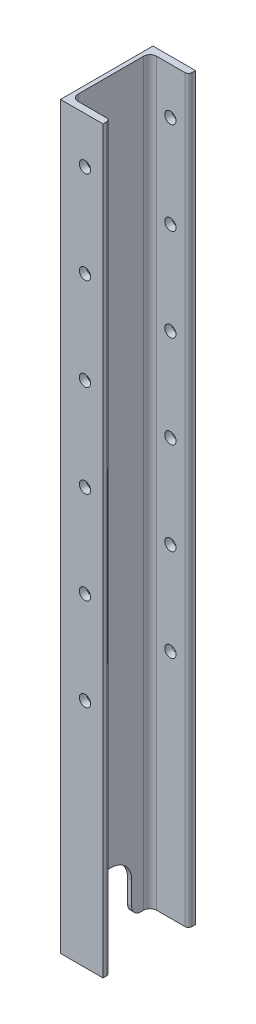
ISO-10303-21;
HEADER;
FILE_DESCRIPTION(('STEP AP214'),'2;1');
FILE_NAME('part.step','',(''),(''),'','','');
FILE_SCHEMA(('AUTOMOTIVE_DESIGN { 1 0 10303 214 1 1 1 1 }'));
ENDSEC;
DATA;
#1=APPLICATION_CONTEXT('core data for automotive mechanical design processes');
#2=APPLICATION_PROTOCOL_DEFINITION('international standard','automotive_design',2000,#1);
#3=PRODUCT_CONTEXT('',#1,'mechanical');
#4=PRODUCT('Part','Part','',(#3));
#5=PRODUCT_RELATED_PRODUCT_CATEGORY('part','',(#4));
#6=PRODUCT_DEFINITION_FORMATION('','',#4);
#7=PRODUCT_DEFINITION_CONTEXT('part definition',#1,'design');
#8=PRODUCT_DEFINITION('design','',#6,#7);
#9=PRODUCT_DEFINITION_SHAPE('','',#8);
#10=(LENGTH_UNIT() NAMED_UNIT(*) SI_UNIT(.MILLI.,.METRE.));
#11=(NAMED_UNIT(*) PLANE_ANGLE_UNIT() SI_UNIT($,.RADIAN.));
#12=(NAMED_UNIT(*) SI_UNIT($,.STERADIAN.) SOLID_ANGLE_UNIT());
#13=UNCERTAINTY_MEASURE_WITH_UNIT(LENGTH_MEASURE(1.E-05),#10,'distance_accuracy_value','');
#14=(GEOMETRIC_REPRESENTATION_CONTEXT(3) GLOBAL_UNCERTAINTY_ASSIGNED_CONTEXT((#13)) GLOBAL_UNIT_ASSIGNED_CONTEXT((#10,
#11,#12)) REPRESENTATION_CONTEXT('',''));
#15=CARTESIAN_POINT('',(0.,0.,0.));
#16=DIRECTION('',(0.,0.,1.));
#17=DIRECTION('',(1.,0.,0.));
#18=AXIS2_PLACEMENT_3D('',#15,#16,#17);
#19=CARTESIAN_POINT('',(11.5,0.,35.4));
#20=DIRECTION('',(0.,1.,0.));
#21=DIRECTION('',(0.,0.,1.));
#22=AXIS2_PLACEMENT_3D('',#19,#20,#21);
#23=PLANE('',#22);
#24=DIRECTION('',(0.,0.,1.));
#25=VECTOR('',#24,1.);
#26=CARTESIAN_POINT('',(0.,0.,50.));
#27=LINE('',#26,#25);
#28=CARTESIAN_POINT('',(0.,0.,32.5));
#29=VERTEX_POINT('',#28);
#30=CARTESIAN_POINT('',(0.,0.,50.));
#31=VERTEX_POINT('',#30);
#32=EDGE_CURVE('E239',#29,#31,#27,.T.);
#33=ORIENTED_EDGE('',*,*,#32,.F.);
#34=DIRECTION('',(1.,0.,0.));
#35=VECTOR('',#34,1.);
#36=CARTESIAN_POINT('',(11.5,0.,32.5));
#37=LINE('',#36,#35);
#38=CARTESIAN_POINT('',(4.50000000000001,0.,32.5));
#39=VERTEX_POINT('',#38);
#40=EDGE_CURVE('E49',#29,#39,#37,.T.);
#41=ORIENTED_EDGE('',*,*,#40,.T.);
#42=DIRECTION('',(0.,0.,-1.));
#43=VECTOR('',#42,1.);
#44=CARTESIAN_POINT('',(4.5,0.,-35.3999999999999));
#45=LINE('',#44,#43);
#46=CARTESIAN_POINT('',(4.50000000000001,0.,35.3999999999999));
#47=VERTEX_POINT('',#46);
#48=EDGE_CURVE('E227',#47,#39,#45,.T.);
#49=ORIENTED_EDGE('',*,*,#48,.F.);
#50=CARTESIAN_POINT('',(11.5,0.,35.4));
#51=DIRECTION('',(0.,-1.,0.));
#52=DIRECTION('',(0.,0.,1.));
#53=AXIS2_PLACEMENT_3D('',#50,#51,#52);
#54=CIRCLE('',#53,7.);
#55=CARTESIAN_POINT('',(11.5000000000001,0.,42.4));
#56=VERTEX_POINT('',#55);
#57=EDGE_CURVE('E192',#56,#47,#54,.T.);
#58=ORIENTED_EDGE('',*,*,#57,.F.);
#59=DIRECTION('',(-1.,0.,0.));
#60=VECTOR('',#59,1.);
#61=CARTESIAN_POINT('',(11.5000000000001,0.,42.4));
#62=LINE('',#61,#60);
#63=CARTESIAN_POINT('',(42.,0.,42.4));
#64=VERTEX_POINT('',#63);
#65=EDGE_CURVE('E204',#64,#56,#62,.T.);
#66=ORIENTED_EDGE('',*,*,#65,.F.);
#67=CARTESIAN_POINT('',(42.,0.,46.4));
#68=DIRECTION('',(0.,1.,0.));
#69=DIRECTION('',(0.,0.,-1.));
#70=AXIS2_PLACEMENT_3D('',#67,#68,#69);
#71=CIRCLE('',#70,4.);
#72=CARTESIAN_POINT('',(46.,0.,46.4));
#73=VERTEX_POINT('',#72);
#74=EDGE_CURVE('E247',#73,#64,#71,.T.);
#75=ORIENTED_EDGE('',*,*,#74,.F.);
#76=DIRECTION('',(0.,0.,-1.));
#77=VECTOR('',#76,1.);
#78=CARTESIAN_POINT('',(46.,0.,46.4));
#79=LINE('',#78,#77);
#80=CARTESIAN_POINT('',(46.,0.,50.));
#81=VERTEX_POINT('',#80);
#82=EDGE_CURVE('E245',#81,#73,#79,.T.);
#83=ORIENTED_EDGE('',*,*,#82,.F.);
#84=DIRECTION('',(1.,0.,0.));
#85=VECTOR('',#84,1.);
#86=CARTESIAN_POINT('',(46.,0.,50.));
#87=LINE('',#86,#85);
#88=EDGE_CURVE('E243',#31,#81,#87,.T.);
#89=ORIENTED_EDGE('',*,*,#88,.F.);
#90=EDGE_LOOP('',(#33,#41,#49,#58,#66,#75,#83,#89));
#91=FACE_BOUND('',#90,.T.);
#92=ADVANCED_FACE('F40',(#91),#23,.F.);
#93=CARTESIAN_POINT('',(11.5,800.,35.4));
#94=DIRECTION('',(0.,-1.,0.));
#95=DIRECTION('',(0.,0.,-1.));
#96=AXIS2_PLACEMENT_3D('',#93,#94,#95);
#97=CYLINDRICAL_SURFACE('',#96,7.);
#98=ORIENTED_EDGE('',*,*,#57,.T.);
#99=DIRECTION('',(0.,-1.,0.));
#100=VECTOR('',#99,1.);
#101=CARTESIAN_POINT('',(4.50000000000001,800.,35.3999999999999));
#102=LINE('',#101,#100);
#103=CARTESIAN_POINT('',(4.50000000000001,800.,35.3999999999999));
#104=VERTEX_POINT('',#103);
#105=EDGE_CURVE('E282',#104,#47,#102,.T.);
#106=ORIENTED_EDGE('',*,*,#105,.F.);
#107=CARTESIAN_POINT('',(11.5,800.,35.4));
#108=DIRECTION('',(0.,-1.,0.));
#109=DIRECTION('',(0.,0.,1.));
#110=AXIS2_PLACEMENT_3D('',#107,#108,#109);
#111=CIRCLE('',#110,7.);
#112=CARTESIAN_POINT('',(11.5000000000001,800.,42.4));
#113=VERTEX_POINT('',#112);
#114=EDGE_CURVE('E200',#113,#104,#111,.T.);
#115=ORIENTED_EDGE('',*,*,#114,.F.);
#116=DIRECTION('',(0.,-1.,0.));
#117=VECTOR('',#116,1.);
#118=CARTESIAN_POINT('',(11.5000000000001,800.,42.4));
#119=LINE('',#118,#117);
#120=EDGE_CURVE('E225',#113,#56,#119,.T.);
#121=ORIENTED_EDGE('',*,*,#120,.T.);
#122=EDGE_LOOP('',(#98,#106,#115,#121));
#123=FACE_BOUND('',#122,.T.);
#124=ADVANCED_FACE('F355',(#123),#97,.F.);
#125=CARTESIAN_POINT('',(4.5,800.,-35.3999999999999));
#126=DIRECTION('',(-1.,0.,0.));
#127=DIRECTION('',(0.,0.,1.));
#128=AXIS2_PLACEMENT_3D('',#125,#126,#127);
#129=PLANE('',#128);
#130=DIRECTION('',(0.,-1.,0.));
#131=VECTOR('',#130,1.);
#132=CARTESIAN_POINT('',(4.5,800.,-22.5000000000001));
#133=LINE('',#132,#131);
#134=CARTESIAN_POINT('',(4.5,35.,-22.5));
#135=VERTEX_POINT('',#134);
#136=CARTESIAN_POINT('',(4.5,10.,-22.5));
#137=VERTEX_POINT('',#136);
#138=EDGE_CURVE('E166',#135,#137,#133,.T.);
#139=ORIENTED_EDGE('',*,*,#138,.T.);
#140=CARTESIAN_POINT('',(4.5,10.,-32.5));
#141=DIRECTION('',(-1.,0.,0.));
#142=DIRECTION('',(0.,0.,1.));
#143=AXIS2_PLACEMENT_3D('',#140,#141,#142);
#144=CIRCLE('',#143,10.);
#145=CARTESIAN_POINT('',(4.5,0.,-32.5));
#146=VERTEX_POINT('',#145);
#147=EDGE_CURVE('E295',#137,#146,#144,.F.);
#148=ORIENTED_EDGE('',*,*,#147,.T.);
#149=CARTESIAN_POINT('',(4.5,0.,-35.3999999999999));
#150=VERTEX_POINT('',#149);
#151=EDGE_CURVE('E195',#146,#150,#45,.T.);
#152=ORIENTED_EDGE('',*,*,#151,.T.);
#153=DIRECTION('',(0.,-1.,0.));
#154=VECTOR('',#153,1.);
#155=CARTESIAN_POINT('',(4.5,800.,-35.3999999999999));
#156=LINE('',#155,#154);
#157=CARTESIAN_POINT('',(4.5,800.,-35.3999999999999));
#158=VERTEX_POINT('',#157);
#159=EDGE_CURVE('E279',#158,#150,#156,.T.);
#160=ORIENTED_EDGE('',*,*,#159,.F.);
#161=DIRECTION('',(0.,0.,-1.));
#162=VECTOR('',#161,1.);
#163=CARTESIAN_POINT('',(4.5,800.,-35.3999999999999));
#164=LINE('',#163,#162);
#165=EDGE_CURVE('E203',#104,#158,#164,.T.);
#166=ORIENTED_EDGE('',*,*,#165,.F.);
#167=ORIENTED_EDGE('',*,*,#105,.T.);
#168=ORIENTED_EDGE('',*,*,#48,.T.);
#169=CARTESIAN_POINT('',(4.50000000000001,10.,32.5));
#170=DIRECTION('',(-1.,0.,0.));
#171=DIRECTION('',(0.,0.,1.));
#172=AXIS2_PLACEMENT_3D('',#169,#170,#171);
#173=CIRCLE('',#172,10.);
#174=CARTESIAN_POINT('',(4.50000000000001,10.,22.5));
#175=VERTEX_POINT('',#174);
#176=EDGE_CURVE('E57',#39,#175,#173,.F.);
#177=ORIENTED_EDGE('',*,*,#176,.T.);
#178=DIRECTION('',(0.,1.,0.));
#179=VECTOR('',#178,1.);
#180=CARTESIAN_POINT('',(4.50000000000001,800.,22.5000000000001));
#181=LINE('',#180,#179);
#182=CARTESIAN_POINT('',(4.50000000000001,35.,22.5));
#183=VERTEX_POINT('',#182);
#184=EDGE_CURVE('E191',#175,#183,#181,.T.);
#185=ORIENTED_EDGE('',*,*,#184,.T.);
#186=CARTESIAN_POINT('',(4.5,35.,0.));
#187=DIRECTION('',(-1.,0.,0.));
#188=DIRECTION('',(0.,0.,1.));
#189=AXIS2_PLACEMENT_3D('',#186,#187,#188);
#190=CIRCLE('',#189,22.5);
#191=EDGE_CURVE('E183',#183,#135,#190,.T.);
#192=ORIENTED_EDGE('',*,*,#191,.T.);
#193=EDGE_LOOP('',(#139,#148,#152,#160,#166,#167,#168,#177,#185,#192));
#194=FACE_BOUND('',#193,.T.);
#195=ADVANCED_FACE('F190',(#194),#129,.F.);
#196=CARTESIAN_POINT('',(11.5,800.,-35.4));
#197=DIRECTION('',(0.,-1.,0.));
#198=DIRECTION('',(0.,0.,-1.));
#199=AXIS2_PLACEMENT_3D('',#196,#197,#198);
#200=CYLINDRICAL_SURFACE('',#199,7.);
#201=CARTESIAN_POINT('',(11.5,0.,-35.4));
#202=DIRECTION('',(0.,-1.,0.));
#203=DIRECTION('',(0.,0.,1.));
#204=AXIS2_PLACEMENT_3D('',#201,#202,#203);
#205=CIRCLE('',#204,7.);
#206=CARTESIAN_POINT('',(11.5,0.,-42.4));
#207=VERTEX_POINT('',#206);
#208=EDGE_CURVE('E229',#150,#207,#205,.T.);
#209=ORIENTED_EDGE('',*,*,#208,.T.);
#210=DIRECTION('',(0.,-1.,0.));
#211=VECTOR('',#210,1.);
#212=CARTESIAN_POINT('',(11.5,800.,-42.4));
#213=LINE('',#212,#211);
#214=CARTESIAN_POINT('',(11.5,800.,-42.4));
#215=VERTEX_POINT('',#214);
#216=EDGE_CURVE('E276',#215,#207,#213,.T.);
#217=ORIENTED_EDGE('',*,*,#216,.F.);
#218=CARTESIAN_POINT('',(11.5,800.,-35.4));
#219=DIRECTION('',(0.,-1.,0.));
#220=DIRECTION('',(0.,0.,1.));
#221=AXIS2_PLACEMENT_3D('',#218,#219,#220);
#222=CIRCLE('',#221,7.);
#223=EDGE_CURVE('E206',#158,#215,#222,.T.);
#224=ORIENTED_EDGE('',*,*,#223,.F.);
#225=ORIENTED_EDGE('',*,*,#159,.T.);
#226=EDGE_LOOP('',(#209,#217,#224,#225));
#227=FACE_BOUND('',#226,.T.);
#228=ADVANCED_FACE('F399',(#227),#200,.F.);
#229=CARTESIAN_POINT('',(42.,800.,-42.4));
#230=DIRECTION('',(0.,0.,-1.));
#231=DIRECTION('',(-1.,0.,0.));
#232=AXIS2_PLACEMENT_3D('',#229,#230,#231);
#233=PLANE('',#232);
#234=CARTESIAN_POINT('',(26.44,750.,-42.4));
#235=DIRECTION('',(0.,0.,-1.));
#236=DIRECTION('',(-1.,0.,0.));
#237=AXIS2_PLACEMENT_3D('',#234,#235,#236);
#238=CIRCLE('',#237,6.10000000000005);
#239=CARTESIAN_POINT('',(20.34,750.,-42.4));
#240=VERTEX_POINT('',#239);
#241=EDGE_CURVE('E188',#240,#240,#238,.T.);
#242=ORIENTED_EDGE('',*,*,#241,.T.);
#243=EDGE_LOOP('',(#242));
#244=FACE_BOUND('',#243,.T.);
#245=CARTESIAN_POINT('',(26.439999999999,650.,-42.4));
#246=DIRECTION('',(0.,0.,-1.));
#247=DIRECTION('',(-1.,0.,0.));
#248=AXIS2_PLACEMENT_3D('',#245,#246,#247);
#249=CIRCLE('',#248,6.10000000000005);
#250=CARTESIAN_POINT('',(20.3399999999989,650.,-42.4));
#251=VERTEX_POINT('',#250);
#252=EDGE_CURVE('E324',#251,#251,#249,.T.);
#253=ORIENTED_EDGE('',*,*,#252,.T.);
#254=EDGE_LOOP('',(#253));
#255=FACE_BOUND('',#254,.T.);
#256=CARTESIAN_POINT('',(26.4399999999979,550.,-42.4));
#257=DIRECTION('',(0.,0.,-1.));
#258=DIRECTION('',(-1.,0.,0.));
#259=AXIS2_PLACEMENT_3D('',#256,#257,#258);
#260=CIRCLE('',#259,6.10000000000003);
#261=CARTESIAN_POINT('',(20.3399999999979,550.,-42.4));
#262=VERTEX_POINT('',#261);
#263=EDGE_CURVE('E320',#262,#262,#260,.T.);
#264=ORIENTED_EDGE('',*,*,#263,.T.);
#265=EDGE_LOOP('',(#264));
#266=FACE_BOUND('',#265,.T.);
#267=CARTESIAN_POINT('',(26.4399999999969,450.,-42.4));
#268=DIRECTION('',(0.,0.,-1.));
#269=DIRECTION('',(-1.,0.,0.));
#270=AXIS2_PLACEMENT_3D('',#267,#268,#269);
#271=CIRCLE('',#270,6.10000000000001);
#272=CARTESIAN_POINT('',(20.3399999999969,450.,-42.4));
#273=VERTEX_POINT('',#272);
#274=EDGE_CURVE('E316',#273,#273,#271,.T.);
#275=ORIENTED_EDGE('',*,*,#274,.T.);
#276=EDGE_LOOP('',(#275));
#277=FACE_BOUND('',#276,.T.);
#278=CARTESIAN_POINT('',(26.4399999999958,350.,-42.4));
#279=DIRECTION('',(0.,0.,-1.));
#280=DIRECTION('',(-1.,0.,0.));
#281=AXIS2_PLACEMENT_3D('',#278,#279,#280);
#282=CIRCLE('',#281,6.10000000000001);
#283=CARTESIAN_POINT('',(20.3399999999958,350.,-42.4));
#284=VERTEX_POINT('',#283);
#285=EDGE_CURVE('E312',#284,#284,#282,.T.);
#286=ORIENTED_EDGE('',*,*,#285,.T.);
#287=EDGE_LOOP('',(#286));
#288=FACE_BOUND('',#287,.T.);
#289=CARTESIAN_POINT('',(26.4399999999948,250.,-42.4));
#290=DIRECTION('',(0.,0.,-1.));
#291=DIRECTION('',(-1.,0.,0.));
#292=AXIS2_PLACEMENT_3D('',#289,#290,#291);
#293=CIRCLE('',#292,6.10000000000001);
#294=CARTESIAN_POINT('',(20.3399999999948,250.,-42.4));
#295=VERTEX_POINT('',#294);
#296=EDGE_CURVE('E307',#295,#295,#293,.T.);
#297=ORIENTED_EDGE('',*,*,#296,.T.);
#298=EDGE_LOOP('',(#297));
#299=FACE_BOUND('',#298,.T.);
#300=DIRECTION('',(1.,0.,0.));
#301=VECTOR('',#300,1.);
#302=CARTESIAN_POINT('',(42.,0.,-42.4));
#303=LINE('',#302,#301);
#304=CARTESIAN_POINT('',(42.,0.,-42.4));
#305=VERTEX_POINT('',#304);
#306=EDGE_CURVE('E231',#207,#305,#303,.T.);
#307=ORIENTED_EDGE('',*,*,#306,.T.);
#308=DIRECTION('',(0.,-1.,0.));
#309=VECTOR('',#308,1.);
#310=CARTESIAN_POINT('',(42.,800.,-42.4));
#311=LINE('',#310,#309);
#312=CARTESIAN_POINT('',(42.,800.,-42.4));
#313=VERTEX_POINT('',#312);
#314=EDGE_CURVE('E273',#313,#305,#311,.T.);
#315=ORIENTED_EDGE('',*,*,#314,.F.);
#316=DIRECTION('',(1.,0.,0.));
#317=VECTOR('',#316,1.);
#318=CARTESIAN_POINT('',(42.,800.,-42.4));
#319=LINE('',#318,#317);
#320=EDGE_CURVE('E208',#215,#313,#319,.T.);
#321=ORIENTED_EDGE('',*,*,#320,.F.);
#322=ORIENTED_EDGE('',*,*,#216,.T.);
#323=EDGE_LOOP('',(#307,#315,#321,#322));
#324=FACE_BOUND('',#323,.T.);
#325=ADVANCED_FACE('F403',(#244,#255,#266,#277,#288,#299,#324),#233,.F.);
#326=CARTESIAN_POINT('',(42.,800.,-46.4));
#327=DIRECTION('',(0.,-1.,0.));
#328=DIRECTION('',(0.,0.,-1.));
#329=AXIS2_PLACEMENT_3D('',#326,#327,#328);
#330=CYLINDRICAL_SURFACE('',#329,4.);
#331=CARTESIAN_POINT('',(42.,0.,-46.4));
#332=DIRECTION('',(0.,1.,0.));
#333=DIRECTION('',(0.,0.,-1.));
#334=AXIS2_PLACEMENT_3D('',#331,#332,#333);
#335=CIRCLE('',#334,4.);
#336=CARTESIAN_POINT('',(46.,0.,-46.4));
#337=VERTEX_POINT('',#336);
#338=EDGE_CURVE('E233',#305,#337,#335,.T.);
#339=ORIENTED_EDGE('',*,*,#338,.T.);
#340=DIRECTION('',(0.,-1.,0.));
#341=VECTOR('',#340,1.);
#342=CARTESIAN_POINT('',(46.,800.,-46.4));
#343=LINE('',#342,#341);
#344=CARTESIAN_POINT('',(46.,800.,-46.4));
#345=VERTEX_POINT('',#344);
#346=EDGE_CURVE('E270',#345,#337,#343,.T.);
#347=ORIENTED_EDGE('',*,*,#346,.F.);
#348=CARTESIAN_POINT('',(42.,800.,-46.4));
#349=DIRECTION('',(0.,1.,0.));
#350=DIRECTION('',(0.,0.,-1.));
#351=AXIS2_PLACEMENT_3D('',#348,#349,#350);
#352=CIRCLE('',#351,4.);
#353=EDGE_CURVE('E210',#313,#345,#352,.T.);
#354=ORIENTED_EDGE('',*,*,#353,.F.);
#355=ORIENTED_EDGE('',*,*,#314,.T.);
#356=EDGE_LOOP('',(#339,#347,#354,#355));
#357=FACE_BOUND('',#356,.T.);
#358=ADVANCED_FACE('F408',(#357),#330,.T.);
#359=CARTESIAN_POINT('',(46.,800.,-50.));
#360=DIRECTION('',(-1.,0.,0.));
#361=DIRECTION('',(0.,0.,1.));
#362=AXIS2_PLACEMENT_3D('',#359,#360,#361);
#363=PLANE('',#362);
#364=DIRECTION('',(0.,0.,-1.));
#365=VECTOR('',#364,1.);
#366=CARTESIAN_POINT('',(46.,0.,-50.));
#367=LINE('',#366,#365);
#368=CARTESIAN_POINT('',(46.,0.,-50.));
#369=VERTEX_POINT('',#368);
#370=EDGE_CURVE('E235',#337,#369,#367,.T.);
#371=ORIENTED_EDGE('',*,*,#370,.T.);
#372=DIRECTION('',(0.,-1.,0.));
#373=VECTOR('',#372,1.);
#374=CARTESIAN_POINT('',(46.,800.,-50.));
#375=LINE('',#374,#373);
#376=CARTESIAN_POINT('',(46.,800.,-50.));
#377=VERTEX_POINT('',#376);
#378=EDGE_CURVE('E267',#377,#369,#375,.T.);
#379=ORIENTED_EDGE('',*,*,#378,.F.);
#380=DIRECTION('',(0.,0.,-1.));
#381=VECTOR('',#380,1.);
#382=CARTESIAN_POINT('',(46.,800.,-50.));
#383=LINE('',#382,#381);
#384=EDGE_CURVE('E212',#345,#377,#383,.T.);
#385=ORIENTED_EDGE('',*,*,#384,.F.);
#386=ORIENTED_EDGE('',*,*,#346,.T.);
#387=EDGE_LOOP('',(#371,#379,#385,#386));
#388=FACE_BOUND('',#387,.T.);
#389=ADVANCED_FACE('F410',(#388),#363,.F.);
#390=CARTESIAN_POINT('',(0.,800.,-50.));
#391=DIRECTION('',(0.,0.,1.));
#392=DIRECTION('',(1.,0.,0.));
#393=AXIS2_PLACEMENT_3D('',#390,#391,#392);
#394=PLANE('',#393);
#395=CARTESIAN_POINT('',(26.44,750.,-50.));
#396=DIRECTION('',(0.,0.,1.));
#397=DIRECTION('',(1.,0.,0.));
#398=AXIS2_PLACEMENT_3D('',#395,#396,#397);
#399=CIRCLE('',#398,6.10000000000005);
#400=CARTESIAN_POINT('',(32.5400000000001,750.,-50.));
#401=VERTEX_POINT('',#400);
#402=EDGE_CURVE('E336',#401,#401,#399,.T.);
#403=ORIENTED_EDGE('',*,*,#402,.T.);
#404=EDGE_LOOP('',(#403));
#405=FACE_BOUND('',#404,.T.);
#406=CARTESIAN_POINT('',(26.439999999999,650.,-50.));
#407=DIRECTION('',(0.,0.,1.));
#408=DIRECTION('',(1.,0.,0.));
#409=AXIS2_PLACEMENT_3D('',#406,#407,#408);
#410=CIRCLE('',#409,6.10000000000005);
#411=CARTESIAN_POINT('',(32.539999999999,650.,-50.));
#412=VERTEX_POINT('',#411);
#413=EDGE_CURVE('E319',#412,#412,#410,.T.);
#414=ORIENTED_EDGE('',*,*,#413,.T.);
#415=EDGE_LOOP('',(#414));
#416=FACE_BOUND('',#415,.T.);
#417=CARTESIAN_POINT('',(26.4399999999979,550.,-50.));
#418=DIRECTION('',(0.,0.,1.));
#419=DIRECTION('',(1.,0.,0.));
#420=AXIS2_PLACEMENT_3D('',#417,#418,#419);
#421=CIRCLE('',#420,6.10000000000003);
#422=CARTESIAN_POINT('',(32.5399999999979,550.,-50.));
#423=VERTEX_POINT('',#422);
#424=EDGE_CURVE('E315',#423,#423,#421,.T.);
#425=ORIENTED_EDGE('',*,*,#424,.T.);
#426=EDGE_LOOP('',(#425));
#427=FACE_BOUND('',#426,.T.);
#428=CARTESIAN_POINT('',(26.4399999999969,450.,-50.));
#429=DIRECTION('',(0.,0.,1.));
#430=DIRECTION('',(1.,0.,0.));
#431=AXIS2_PLACEMENT_3D('',#428,#429,#430);
#432=CIRCLE('',#431,6.10000000000001);
#433=CARTESIAN_POINT('',(32.5399999999969,450.,-50.));
#434=VERTEX_POINT('',#433);
#435=EDGE_CURVE('E311',#434,#434,#432,.T.);
#436=ORIENTED_EDGE('',*,*,#435,.T.);
#437=EDGE_LOOP('',(#436));
#438=FACE_BOUND('',#437,.T.);
#439=CARTESIAN_POINT('',(26.4399999999958,350.,-50.));
#440=DIRECTION('',(0.,0.,1.));
#441=DIRECTION('',(1.,0.,0.));
#442=AXIS2_PLACEMENT_3D('',#439,#440,#441);
#443=CIRCLE('',#442,6.10000000000001);
#444=CARTESIAN_POINT('',(32.5399999999958,350.,-50.));
#445=VERTEX_POINT('',#444);
#446=EDGE_CURVE('E306',#445,#445,#443,.T.);
#447=ORIENTED_EDGE('',*,*,#446,.T.);
#448=EDGE_LOOP('',(#447));
#449=FACE_BOUND('',#448,.T.);
#450=CARTESIAN_POINT('',(26.4399999999948,250.,-50.));
#451=DIRECTION('',(0.,0.,1.));
#452=DIRECTION('',(1.,0.,0.));
#453=AXIS2_PLACEMENT_3D('',#450,#451,#452);
#454=CIRCLE('',#453,6.10000000000001);
#455=CARTESIAN_POINT('',(32.5399999999948,250.,-50.));
#456=VERTEX_POINT('',#455);
#457=EDGE_CURVE('E301',#456,#456,#454,.T.);
#458=ORIENTED_EDGE('',*,*,#457,.T.);
#459=EDGE_LOOP('',(#458));
#460=FACE_BOUND('',#459,.T.);
#461=DIRECTION('',(-1.,0.,0.));
#462=VECTOR('',#461,1.);
#463=CARTESIAN_POINT('',(0.,0.,-50.));
#464=LINE('',#463,#462);
#465=CARTESIAN_POINT('',(0.,0.,-50.));
#466=VERTEX_POINT('',#465);
#467=EDGE_CURVE('E237',#369,#466,#464,.T.);
#468=ORIENTED_EDGE('',*,*,#467,.T.);
#469=DIRECTION('',(0.,-1.,0.));
#470=VECTOR('',#469,1.);
#471=CARTESIAN_POINT('',(0.,800.,-50.));
#472=LINE('',#471,#470);
#473=CARTESIAN_POINT('',(0.,800.,-50.));
#474=VERTEX_POINT('',#473);
#475=EDGE_CURVE('E264',#474,#466,#472,.T.);
#476=ORIENTED_EDGE('',*,*,#475,.F.);
#477=DIRECTION('',(-1.,0.,0.));
#478=VECTOR('',#477,1.);
#479=CARTESIAN_POINT('',(0.,800.,-50.));
#480=LINE('',#479,#478);
#481=EDGE_CURVE('E214',#377,#474,#480,.T.);
#482=ORIENTED_EDGE('',*,*,#481,.F.);
#483=ORIENTED_EDGE('',*,*,#378,.T.);
#484=EDGE_LOOP('',(#468,#476,#482,#483));
#485=FACE_BOUND('',#484,.T.);
#486=ADVANCED_FACE('F385',(#405,#416,#427,#438,#449,#460,#485),#394,.F.);
#487=CARTESIAN_POINT('',(0.,800.,50.));
#488=DIRECTION('',(1.,0.,0.));
#489=DIRECTION('',(0.,0.,-1.));
#490=AXIS2_PLACEMENT_3D('',#487,#488,#489);
#491=PLANE('',#490);
#492=CARTESIAN_POINT('',(0.,0.,-32.5));
#493=VERTEX_POINT('',#492);
#494=EDGE_CURVE('E240',#466,#493,#27,.T.);
#495=ORIENTED_EDGE('',*,*,#494,.T.);
#496=CARTESIAN_POINT('',(0.,10.,-32.5));
#497=DIRECTION('',(1.,0.,0.));
#498=DIRECTION('',(0.,0.,-1.));
#499=AXIS2_PLACEMENT_3D('',#496,#497,#498);
#500=CIRCLE('',#499,10.);
#501=CARTESIAN_POINT('',(0.,10.,-22.5));
#502=VERTEX_POINT('',#501);
#503=EDGE_CURVE('E291',#493,#502,#500,.F.);
#504=ORIENTED_EDGE('',*,*,#503,.T.);
#505=DIRECTION('',(0.,1.,0.));
#506=VECTOR('',#505,1.);
#507=CARTESIAN_POINT('',(0.,800.,-22.5000000000001));
#508=LINE('',#507,#506);
#509=CARTESIAN_POINT('',(0.,35.,-22.5));
#510=VERTEX_POINT('',#509);
#511=EDGE_CURVE('E177',#502,#510,#508,.T.);
#512=ORIENTED_EDGE('',*,*,#511,.T.);
#513=CARTESIAN_POINT('',(0.,35.,0.));
#514=DIRECTION('',(-1.,0.,0.));
#515=DIRECTION('',(0.,0.,1.));
#516=AXIS2_PLACEMENT_3D('',#513,#514,#515);
#517=CIRCLE('',#516,22.5);
#518=CARTESIAN_POINT('',(0.,35.,22.5));
#519=VERTEX_POINT('',#518);
#520=EDGE_CURVE('E186',#510,#519,#517,.F.);
#521=ORIENTED_EDGE('',*,*,#520,.T.);
#522=DIRECTION('',(0.,-1.,0.));
#523=VECTOR('',#522,1.);
#524=CARTESIAN_POINT('',(0.,800.,22.5000000000001));
#525=LINE('',#524,#523);
#526=CARTESIAN_POINT('',(0.,10.,22.5));
#527=VERTEX_POINT('',#526);
#528=EDGE_CURVE('E176',#519,#527,#525,.T.);
#529=ORIENTED_EDGE('',*,*,#528,.T.);
#530=CARTESIAN_POINT('',(0.,10.,32.5));
#531=DIRECTION('',(1.,0.,0.));
#532=DIRECTION('',(0.,0.,-1.));
#533=AXIS2_PLACEMENT_3D('',#530,#531,#532);
#534=CIRCLE('',#533,10.);
#535=EDGE_CURVE('E289',#527,#29,#534,.F.);
#536=ORIENTED_EDGE('',*,*,#535,.T.);
#537=ORIENTED_EDGE('',*,*,#32,.T.);
#538=DIRECTION('',(0.,-1.,0.));
#539=VECTOR('',#538,1.);
#540=CARTESIAN_POINT('',(0.,800.,50.));
#541=LINE('',#540,#539);
#542=CARTESIAN_POINT('',(0.,800.,50.));
#543=VERTEX_POINT('',#542);
#544=EDGE_CURVE('E261',#543,#31,#541,.T.);
#545=ORIENTED_EDGE('',*,*,#544,.F.);
#546=DIRECTION('',(0.,0.,1.));
#547=VECTOR('',#546,1.);
#548=CARTESIAN_POINT('',(0.,800.,50.));
#549=LINE('',#548,#547);
#550=EDGE_CURVE('E216',#474,#543,#549,.T.);
#551=ORIENTED_EDGE('',*,*,#550,.F.);
#552=ORIENTED_EDGE('',*,*,#475,.T.);
#553=EDGE_LOOP('',(#495,#504,#512,#521,#529,#536,#537,#545,#551,#552));
#554=FACE_BOUND('',#553,.T.);
#555=ADVANCED_FACE('F345',(#554),#491,.F.);
#556=CARTESIAN_POINT('',(46.,800.,50.));
#557=DIRECTION('',(0.,0.,-1.));
#558=DIRECTION('',(-1.,0.,0.));
#559=AXIS2_PLACEMENT_3D('',#556,#557,#558);
#560=PLANE('',#559);
#561=CARTESIAN_POINT('',(26.44,750.,50.));
#562=DIRECTION('',(0.,0.,-1.));
#563=DIRECTION('',(-1.,0.,0.));
#564=AXIS2_PLACEMENT_3D('',#561,#562,#563);
#565=CIRCLE('',#564,6.10000000000005);
#566=CARTESIAN_POINT('',(20.34,750.,50.));
#567=VERTEX_POINT('',#566);
#568=EDGE_CURVE('E302',#567,#567,#565,.T.);
#569=ORIENTED_EDGE('',*,*,#568,.T.);
#570=EDGE_LOOP('',(#569));
#571=FACE_BOUND('',#570,.T.);
#572=CARTESIAN_POINT('',(26.439999999999,650.,50.));
#573=DIRECTION('',(0.,0.,-1.));
#574=DIRECTION('',(-1.,0.,0.));
#575=AXIS2_PLACEMENT_3D('',#572,#573,#574);
#576=CIRCLE('',#575,6.10000000000005);
#577=CARTESIAN_POINT('',(20.3399999999989,650.,50.));
#578=VERTEX_POINT('',#577);
#579=EDGE_CURVE('E636',#578,#578,#576,.T.);
#580=ORIENTED_EDGE('',*,*,#579,.T.);
#581=EDGE_LOOP('',(#580));
#582=FACE_BOUND('',#581,.T.);
#583=CARTESIAN_POINT('',(26.4399999999979,550.,50.));
#584=DIRECTION('',(0.,0.,-1.));
#585=DIRECTION('',(-1.,0.,0.));
#586=AXIS2_PLACEMENT_3D('',#583,#584,#585);
#587=CIRCLE('',#586,6.10000000000003);
#588=CARTESIAN_POINT('',(20.3399999999979,550.,50.));
#589=VERTEX_POINT('',#588);
#590=EDGE_CURVE('E634',#589,#589,#587,.T.);
#591=ORIENTED_EDGE('',*,*,#590,.T.);
#592=EDGE_LOOP('',(#591));
#593=FACE_BOUND('',#592,.T.);
#594=CARTESIAN_POINT('',(26.4399999999969,450.,50.));
#595=DIRECTION('',(0.,0.,-1.));
#596=DIRECTION('',(-1.,0.,0.));
#597=AXIS2_PLACEMENT_3D('',#594,#595,#596);
#598=CIRCLE('',#597,6.10000000000001);
#599=CARTESIAN_POINT('',(20.3399999999969,450.,50.));
#600=VERTEX_POINT('',#599);
#601=EDGE_CURVE('E515',#600,#600,#598,.T.);
#602=ORIENTED_EDGE('',*,*,#601,.T.);
#603=EDGE_LOOP('',(#602));
#604=FACE_BOUND('',#603,.T.);
#605=CARTESIAN_POINT('',(26.4399999999958,350.,50.));
#606=DIRECTION('',(0.,0.,-1.));
#607=DIRECTION('',(-1.,0.,0.));
#608=AXIS2_PLACEMENT_3D('',#605,#606,#607);
#609=CIRCLE('',#608,6.10000000000001);
#610=CARTESIAN_POINT('',(20.3399999999958,350.,50.));
#611=VERTEX_POINT('',#610);
#612=EDGE_CURVE('E512',#611,#611,#609,.T.);
#613=ORIENTED_EDGE('',*,*,#612,.T.);
#614=EDGE_LOOP('',(#613));
#615=FACE_BOUND('',#614,.T.);
#616=CARTESIAN_POINT('',(26.4399999999948,250.,50.));
#617=DIRECTION('',(0.,0.,-1.));
#618=DIRECTION('',(-1.,0.,0.));
#619=AXIS2_PLACEMENT_3D('',#616,#617,#618);
#620=CIRCLE('',#619,6.10000000000001);
#621=CARTESIAN_POINT('',(20.3399999999948,250.,50.));
#622=VERTEX_POINT('',#621);
#623=EDGE_CURVE('E510',#622,#622,#620,.T.);
#624=ORIENTED_EDGE('',*,*,#623,.T.);
#625=EDGE_LOOP('',(#624));
#626=FACE_BOUND('',#625,.T.);
#627=ORIENTED_EDGE('',*,*,#88,.T.);
#628=DIRECTION('',(0.,-1.,0.));
#629=VECTOR('',#628,1.);
#630=CARTESIAN_POINT('',(46.,800.,50.));
#631=LINE('',#630,#629);
#632=CARTESIAN_POINT('',(46.,800.,50.));
#633=VERTEX_POINT('',#632);
#634=EDGE_CURVE('E258',#633,#81,#631,.T.);
#635=ORIENTED_EDGE('',*,*,#634,.F.);
#636=DIRECTION('',(1.,0.,0.));
#637=VECTOR('',#636,1.);
#638=CARTESIAN_POINT('',(46.,800.,50.));
#639=LINE('',#638,#637);
#640=EDGE_CURVE('E218',#543,#633,#639,.T.);
#641=ORIENTED_EDGE('',*,*,#640,.F.);
#642=ORIENTED_EDGE('',*,*,#544,.T.);
#643=EDGE_LOOP('',(#627,#635,#641,#642));
#644=FACE_BOUND('',#643,.T.);
#645=ADVANCED_FACE('F373',(#571,#582,#593,#604,#615,#626,#644),#560,.F.);
#646=CARTESIAN_POINT('',(46.,800.,46.4));
#647=DIRECTION('',(-1.,0.,0.));
#648=DIRECTION('',(0.,0.,1.));
#649=AXIS2_PLACEMENT_3D('',#646,#647,#648);
#650=PLANE('',#649);
#651=ORIENTED_EDGE('',*,*,#82,.T.);
#652=DIRECTION('',(0.,-1.,0.));
#653=VECTOR('',#652,1.);
#654=CARTESIAN_POINT('',(46.,800.,46.4));
#655=LINE('',#654,#653);
#656=CARTESIAN_POINT('',(46.,800.,46.4));
#657=VERTEX_POINT('',#656);
#658=EDGE_CURVE('E255',#657,#73,#655,.T.);
#659=ORIENTED_EDGE('',*,*,#658,.F.);
#660=DIRECTION('',(0.,0.,-1.));
#661=VECTOR('',#660,1.);
#662=CARTESIAN_POINT('',(46.,800.,46.4));
#663=LINE('',#662,#661);
#664=EDGE_CURVE('E220',#633,#657,#663,.T.);
#665=ORIENTED_EDGE('',*,*,#664,.F.);
#666=ORIENTED_EDGE('',*,*,#634,.T.);
#667=EDGE_LOOP('',(#651,#659,#665,#666));
#668=FACE_BOUND('',#667,.T.);
#669=ADVANCED_FACE('F370',(#668),#650,.F.);
#670=CARTESIAN_POINT('',(42.,800.,46.4));
#671=DIRECTION('',(0.,-1.,0.));
#672=DIRECTION('',(0.,0.,-1.));
#673=AXIS2_PLACEMENT_3D('',#670,#671,#672);
#674=CYLINDRICAL_SURFACE('',#673,4.);
#675=ORIENTED_EDGE('',*,*,#74,.T.);
#676=DIRECTION('',(0.,-1.,0.));
#677=VECTOR('',#676,1.);
#678=CARTESIAN_POINT('',(42.,800.,42.4));
#679=LINE('',#678,#677);
#680=CARTESIAN_POINT('',(42.,800.,42.4));
#681=VERTEX_POINT('',#680);
#682=EDGE_CURVE('E252',#681,#64,#679,.T.);
#683=ORIENTED_EDGE('',*,*,#682,.F.);
#684=CARTESIAN_POINT('',(42.,800.,46.4));
#685=DIRECTION('',(0.,1.,0.));
#686=DIRECTION('',(0.,0.,-1.));
#687=AXIS2_PLACEMENT_3D('',#684,#685,#686);
#688=CIRCLE('',#687,4.);
#689=EDGE_CURVE('E222',#657,#681,#688,.T.);
#690=ORIENTED_EDGE('',*,*,#689,.F.);
#691=ORIENTED_EDGE('',*,*,#658,.T.);
#692=EDGE_LOOP('',(#675,#683,#690,#691));
#693=FACE_BOUND('',#692,.T.);
#694=ADVANCED_FACE('F366',(#693),#674,.T.);
#695=CARTESIAN_POINT('',(11.5000000000001,800.,42.4));
#696=DIRECTION('',(0.,0.,1.));
#697=DIRECTION('',(1.,0.,0.));
#698=AXIS2_PLACEMENT_3D('',#695,#696,#697);
#699=PLANE('',#698);
#700=CARTESIAN_POINT('',(26.44,750.,42.4));
#701=DIRECTION('',(0.,0.,1.));
#702=DIRECTION('',(1.,0.,0.));
#703=AXIS2_PLACEMENT_3D('',#700,#701,#702);
#704=CIRCLE('',#703,6.10000000000005);
#705=CARTESIAN_POINT('',(32.5400000000001,750.,42.4));
#706=VERTEX_POINT('',#705);
#707=EDGE_CURVE('E44',#706,#706,#704,.T.);
#708=ORIENTED_EDGE('',*,*,#707,.T.);
#709=EDGE_LOOP('',(#708));
#710=FACE_BOUND('',#709,.T.);
#711=CARTESIAN_POINT('',(26.439999999999,650.,42.4));
#712=DIRECTION('',(0.,0.,1.));
#713=DIRECTION('',(1.,0.,0.));
#714=AXIS2_PLACEMENT_3D('',#711,#712,#713);
#715=CIRCLE('',#714,6.10000000000005);
#716=CARTESIAN_POINT('',(32.539999999999,650.,42.4));
#717=VERTEX_POINT('',#716);
#718=EDGE_CURVE('E317',#717,#717,#715,.T.);
#719=ORIENTED_EDGE('',*,*,#718,.T.);
#720=EDGE_LOOP('',(#719));
#721=FACE_BOUND('',#720,.T.);
#722=CARTESIAN_POINT('',(26.4399999999979,550.,42.4));
#723=DIRECTION('',(0.,0.,1.));
#724=DIRECTION('',(1.,0.,0.));
#725=AXIS2_PLACEMENT_3D('',#722,#723,#724);
#726=CIRCLE('',#725,6.10000000000003);
#727=CARTESIAN_POINT('',(32.5399999999979,550.,42.4));
#728=VERTEX_POINT('',#727);
#729=EDGE_CURVE('E313',#728,#728,#726,.T.);
#730=ORIENTED_EDGE('',*,*,#729,.T.);
#731=EDGE_LOOP('',(#730));
#732=FACE_BOUND('',#731,.T.);
#733=CARTESIAN_POINT('',(26.4399999999969,450.,42.4));
#734=DIRECTION('',(0.,0.,1.));
#735=DIRECTION('',(1.,0.,0.));
#736=AXIS2_PLACEMENT_3D('',#733,#734,#735);
#737=CIRCLE('',#736,6.10000000000001);
#738=CARTESIAN_POINT('',(32.5399999999969,450.,42.4));
#739=VERTEX_POINT('',#738);
#740=EDGE_CURVE('E308',#739,#739,#737,.T.);
#741=ORIENTED_EDGE('',*,*,#740,.T.);
#742=EDGE_LOOP('',(#741));
#743=FACE_BOUND('',#742,.T.);
#744=CARTESIAN_POINT('',(26.4399999999958,350.,42.4));
#745=DIRECTION('',(0.,0.,1.));
#746=DIRECTION('',(1.,0.,0.));
#747=AXIS2_PLACEMENT_3D('',#744,#745,#746);
#748=CIRCLE('',#747,6.10000000000001);
#749=CARTESIAN_POINT('',(32.5399999999958,350.,42.4));
#750=VERTEX_POINT('',#749);
#751=EDGE_CURVE('E303',#750,#750,#748,.T.);
#752=ORIENTED_EDGE('',*,*,#751,.T.);
#753=EDGE_LOOP('',(#752));
#754=FACE_BOUND('',#753,.T.);
#755=CARTESIAN_POINT('',(26.4399999999948,250.,42.4));
#756=DIRECTION('',(0.,0.,1.));
#757=DIRECTION('',(1.,0.,0.));
#758=AXIS2_PLACEMENT_3D('',#755,#756,#757);
#759=CIRCLE('',#758,6.10000000000001);
#760=CARTESIAN_POINT('',(32.5399999999948,250.,42.4));
#761=VERTEX_POINT('',#760);
#762=EDGE_CURVE('E298',#761,#761,#759,.T.);
#763=ORIENTED_EDGE('',*,*,#762,.T.);
#764=EDGE_LOOP('',(#763));
#765=FACE_BOUND('',#764,.T.);
#766=ORIENTED_EDGE('',*,*,#65,.T.);
#767=ORIENTED_EDGE('',*,*,#120,.F.);
#768=DIRECTION('',(-1.,0.,0.));
#769=VECTOR('',#768,1.);
#770=CARTESIAN_POINT('',(11.5000000000001,800.,42.4));
#771=LINE('',#770,#769);
#772=EDGE_CURVE('E224',#681,#113,#771,.T.);
#773=ORIENTED_EDGE('',*,*,#772,.F.);
#774=ORIENTED_EDGE('',*,*,#682,.T.);
#775=EDGE_LOOP('',(#766,#767,#773,#774));
#776=FACE_BOUND('',#775,.T.);
#777=ADVANCED_FACE('F361',(#710,#721,#732,#743,#754,#765,#776),#699,.F.);
#778=CARTESIAN_POINT('',(11.5,800.,35.4));
#779=DIRECTION('',(0.,1.,0.));
#780=DIRECTION('',(0.,0.,1.));
#781=AXIS2_PLACEMENT_3D('',#778,#779,#780);
#782=PLANE('',#781);
#783=ORIENTED_EDGE('',*,*,#114,.T.);
#784=ORIENTED_EDGE('',*,*,#165,.T.);
#785=ORIENTED_EDGE('',*,*,#223,.T.);
#786=ORIENTED_EDGE('',*,*,#320,.T.);
#787=ORIENTED_EDGE('',*,*,#353,.T.);
#788=ORIENTED_EDGE('',*,*,#384,.T.);
#789=ORIENTED_EDGE('',*,*,#481,.T.);
#790=ORIENTED_EDGE('',*,*,#550,.T.);
#791=ORIENTED_EDGE('',*,*,#640,.T.);
#792=ORIENTED_EDGE('',*,*,#664,.T.);
#793=ORIENTED_EDGE('',*,*,#689,.T.);
#794=ORIENTED_EDGE('',*,*,#772,.T.);
#795=EDGE_LOOP('',(#783,#784,#785,#786,#787,#788,#789,#790,#791,#792,#793,#794));
#796=FACE_BOUND('',#795,.T.);
#797=ADVANCED_FACE('F380',(#796),#782,.T.);
#798=ORIENTED_EDGE('',*,*,#151,.F.);
#799=DIRECTION('',(-1.,0.,0.));
#800=VECTOR('',#799,1.);
#801=CARTESIAN_POINT('',(11.5,0.,-32.5));
#802=LINE('',#801,#800);
#803=EDGE_CURVE('E286',#146,#493,#802,.T.);
#804=ORIENTED_EDGE('',*,*,#803,.T.);
#805=ORIENTED_EDGE('',*,*,#494,.F.);
#806=ORIENTED_EDGE('',*,*,#467,.F.);
#807=ORIENTED_EDGE('',*,*,#370,.F.);
#808=ORIENTED_EDGE('',*,*,#338,.F.);
#809=ORIENTED_EDGE('',*,*,#306,.F.);
#810=ORIENTED_EDGE('',*,*,#208,.F.);
#811=EDGE_LOOP('',(#798,#804,#805,#806,#807,#808,#809,#810));
#812=FACE_BOUND('',#811,.T.);
#813=ADVANCED_FACE('F390',(#812),#23,.F.);
#814=CARTESIAN_POINT('',(46.,35.,0.));
#815=DIRECTION('',(-1.,0.,0.));
#816=DIRECTION('',(0.,0.,1.));
#817=AXIS2_PLACEMENT_3D('',#814,#815,#816);
#818=CYLINDRICAL_SURFACE('',#817,22.5);
#819=DIRECTION('',(-1.,0.,0.));
#820=VECTOR('',#819,1.);
#821=CARTESIAN_POINT('',(46.,35.,22.5));
#822=LINE('',#821,#820);
#823=EDGE_CURVE('E187',#183,#519,#822,.T.);
#824=ORIENTED_EDGE('',*,*,#823,.T.);
#825=ORIENTED_EDGE('',*,*,#520,.F.);
#826=DIRECTION('',(-1.,0.,0.));
#827=VECTOR('',#826,1.);
#828=CARTESIAN_POINT('',(46.,35.,-22.5));
#829=LINE('',#828,#827);
#830=EDGE_CURVE('E170',#135,#510,#829,.T.);
#831=ORIENTED_EDGE('',*,*,#830,.F.);
#832=ORIENTED_EDGE('',*,*,#191,.F.);
#833=EDGE_LOOP('',(#824,#825,#831,#832));
#834=FACE_BOUND('',#833,.T.);
#835=ADVANCED_FACE('F182',(#834),#818,.F.);
#836=CARTESIAN_POINT('',(46.,0.,22.5));
#837=DIRECTION('',(0.,0.,1.));
#838=DIRECTION('',(0.,-1.,0.));
#839=AXIS2_PLACEMENT_3D('',#836,#837,#838);
#840=PLANE('',#839);
#841=ORIENTED_EDGE('',*,*,#184,.F.);
#842=DIRECTION('',(1.,0.,0.));
#843=VECTOR('',#842,1.);
#844=CARTESIAN_POINT('',(46.,10.,22.5));
#845=LINE('',#844,#843);
#846=EDGE_CURVE('E11',#175,#527,#845,.F.);
#847=ORIENTED_EDGE('',*,*,#846,.T.);
#848=ORIENTED_EDGE('',*,*,#528,.F.);
#849=ORIENTED_EDGE('',*,*,#823,.F.);
#850=EDGE_LOOP('',(#841,#847,#848,#849));
#851=FACE_BOUND('',#850,.T.);
#852=ADVANCED_FACE('F436',(#851),#840,.F.);
#853=CARTESIAN_POINT('',(46.,35.,-22.5));
#854=DIRECTION('',(0.,0.,-1.));
#855=DIRECTION('',(0.,1.,0.));
#856=AXIS2_PLACEMENT_3D('',#853,#854,#855);
#857=PLANE('',#856);
#858=ORIENTED_EDGE('',*,*,#511,.F.);
#859=DIRECTION('',(-1.,0.,0.));
#860=VECTOR('',#859,1.);
#861=CARTESIAN_POINT('',(46.,10.,-22.5));
#862=LINE('',#861,#860);
#863=EDGE_CURVE('E173',#502,#137,#862,.F.);
#864=ORIENTED_EDGE('',*,*,#863,.T.);
#865=ORIENTED_EDGE('',*,*,#138,.F.);
#866=ORIENTED_EDGE('',*,*,#830,.T.);
#867=EDGE_LOOP('',(#858,#864,#865,#866));
#868=FACE_BOUND('',#867,.T.);
#869=ADVANCED_FACE('F169',(#868),#857,.F.);
#870=CARTESIAN_POINT('',(11.5,10.,-32.5));
#871=DIRECTION('',(-1.,0.,0.));
#872=DIRECTION('',(0.,0.,1.));
#873=AXIS2_PLACEMENT_3D('',#870,#871,#872);
#874=CYLINDRICAL_SURFACE('',#873,10.);
#875=ORIENTED_EDGE('',*,*,#147,.F.);
#876=ORIENTED_EDGE('',*,*,#863,.F.);
#877=ORIENTED_EDGE('',*,*,#503,.F.);
#878=ORIENTED_EDGE('',*,*,#803,.F.);
#879=EDGE_LOOP('',(#875,#876,#877,#878));
#880=FACE_BOUND('',#879,.T.);
#881=ADVANCED_FACE('F394',(#880),#874,.T.);
#882=CARTESIAN_POINT('',(11.5,10.,32.5));
#883=DIRECTION('',(1.,0.,0.));
#884=DIRECTION('',(0.,0.,-1.));
#885=AXIS2_PLACEMENT_3D('',#882,#883,#884);
#886=CYLINDRICAL_SURFACE('',#885,10.);
#887=ORIENTED_EDGE('',*,*,#535,.F.);
#888=ORIENTED_EDGE('',*,*,#846,.F.);
#889=ORIENTED_EDGE('',*,*,#176,.F.);
#890=ORIENTED_EDGE('',*,*,#40,.F.);
#891=EDGE_LOOP('',(#887,#888,#889,#890));
#892=FACE_BOUND('',#891,.T.);
#893=ADVANCED_FACE('F42',(#892),#886,.T.);
#894=CARTESIAN_POINT('',(26.4399999999948,250.,50.));
#895=DIRECTION('',(0.,0.,-1.));
#896=DIRECTION('',(-1.,0.,0.));
#897=AXIS2_PLACEMENT_3D('',#894,#895,#896);
#898=CYLINDRICAL_SURFACE('',#897,6.10000000000001);
#899=ORIENTED_EDGE('',*,*,#623,.F.);
#900=EDGE_LOOP('',(#899));
#901=FACE_BOUND('',#900,.T.);
#902=ORIENTED_EDGE('',*,*,#762,.F.);
#903=EDGE_LOOP('',(#902));
#904=FACE_BOUND('',#903,.T.);
#905=ADVANCED_FACE('F454',(#901,#904),#898,.F.);
#906=CARTESIAN_POINT('',(26.4399999999958,350.,50.));
#907=DIRECTION('',(0.,0.,-1.));
#908=DIRECTION('',(-1.,0.,0.));
#909=AXIS2_PLACEMENT_3D('',#906,#907,#908);
#910=CYLINDRICAL_SURFACE('',#909,6.10000000000001);
#911=ORIENTED_EDGE('',*,*,#612,.F.);
#912=EDGE_LOOP('',(#911));
#913=FACE_BOUND('',#912,.T.);
#914=ORIENTED_EDGE('',*,*,#751,.F.);
#915=EDGE_LOOP('',(#914));
#916=FACE_BOUND('',#915,.T.);
#917=ADVANCED_FACE('F459',(#913,#916),#910,.F.);
#918=CARTESIAN_POINT('',(26.4399999999969,450.,50.));
#919=DIRECTION('',(0.,0.,-1.));
#920=DIRECTION('',(-1.,0.,0.));
#921=AXIS2_PLACEMENT_3D('',#918,#919,#920);
#922=CYLINDRICAL_SURFACE('',#921,6.10000000000001);
#923=ORIENTED_EDGE('',*,*,#601,.F.);
#924=EDGE_LOOP('',(#923));
#925=FACE_BOUND('',#924,.T.);
#926=ORIENTED_EDGE('',*,*,#740,.F.);
#927=EDGE_LOOP('',(#926));
#928=FACE_BOUND('',#927,.T.);
#929=ADVANCED_FACE('F464',(#925,#928),#922,.F.);
#930=CARTESIAN_POINT('',(26.4399999999979,550.,50.));
#931=DIRECTION('',(0.,0.,-1.));
#932=DIRECTION('',(-1.,0.,0.));
#933=AXIS2_PLACEMENT_3D('',#930,#931,#932);
#934=CYLINDRICAL_SURFACE('',#933,6.10000000000003);
#935=ORIENTED_EDGE('',*,*,#590,.F.);
#936=EDGE_LOOP('',(#935));
#937=FACE_BOUND('',#936,.T.);
#938=ORIENTED_EDGE('',*,*,#729,.F.);
#939=EDGE_LOOP('',(#938));
#940=FACE_BOUND('',#939,.T.);
#941=ADVANCED_FACE('F469',(#937,#940),#934,.F.);
#942=CARTESIAN_POINT('',(26.439999999999,650.,50.));
#943=DIRECTION('',(0.,0.,-1.));
#944=DIRECTION('',(-1.,0.,0.));
#945=AXIS2_PLACEMENT_3D('',#942,#943,#944);
#946=CYLINDRICAL_SURFACE('',#945,6.10000000000005);
#947=ORIENTED_EDGE('',*,*,#579,.F.);
#948=EDGE_LOOP('',(#947));
#949=FACE_BOUND('',#948,.T.);
#950=ORIENTED_EDGE('',*,*,#718,.F.);
#951=EDGE_LOOP('',(#950));
#952=FACE_BOUND('',#951,.T.);
#953=ADVANCED_FACE('F474',(#949,#952),#946,.F.);
#954=CARTESIAN_POINT('',(26.44,750.,50.));
#955=DIRECTION('',(0.,0.,-1.));
#956=DIRECTION('',(-1.,0.,0.));
#957=AXIS2_PLACEMENT_3D('',#954,#955,#956);
#958=CYLINDRICAL_SURFACE('',#957,6.10000000000005);
#959=ORIENTED_EDGE('',*,*,#568,.F.);
#960=EDGE_LOOP('',(#959));
#961=FACE_BOUND('',#960,.T.);
#962=ORIENTED_EDGE('',*,*,#707,.F.);
#963=EDGE_LOOP('',(#962));
#964=FACE_BOUND('',#963,.T.);
#965=ADVANCED_FACE('F452',(#961,#964),#958,.F.);
#966=ORIENTED_EDGE('',*,*,#457,.F.);
#967=EDGE_LOOP('',(#966));
#968=FACE_BOUND('',#967,.T.);
#969=ORIENTED_EDGE('',*,*,#296,.F.);
#970=EDGE_LOOP('',(#969));
#971=FACE_BOUND('',#970,.T.);
#972=ADVANCED_FACE('F448',(#968,#971),#898,.F.);
#973=ORIENTED_EDGE('',*,*,#446,.F.);
#974=EDGE_LOOP('',(#973));
#975=FACE_BOUND('',#974,.T.);
#976=ORIENTED_EDGE('',*,*,#285,.F.);
#977=EDGE_LOOP('',(#976));
#978=FACE_BOUND('',#977,.T.);
#979=ADVANCED_FACE('F451',(#975,#978),#910,.F.);
#980=ORIENTED_EDGE('',*,*,#435,.F.);
#981=EDGE_LOOP('',(#980));
#982=FACE_BOUND('',#981,.T.);
#983=ORIENTED_EDGE('',*,*,#274,.F.);
#984=EDGE_LOOP('',(#983));
#985=FACE_BOUND('',#984,.T.);
#986=ADVANCED_FACE('F457',(#982,#985),#922,.F.);
#987=ORIENTED_EDGE('',*,*,#424,.F.);
#988=EDGE_LOOP('',(#987));
#989=FACE_BOUND('',#988,.T.);
#990=ORIENTED_EDGE('',*,*,#263,.F.);
#991=EDGE_LOOP('',(#990));
#992=FACE_BOUND('',#991,.T.);
#993=ADVANCED_FACE('F462',(#989,#992),#934,.F.);
#994=ORIENTED_EDGE('',*,*,#413,.F.);
#995=EDGE_LOOP('',(#994));
#996=FACE_BOUND('',#995,.T.);
#997=ORIENTED_EDGE('',*,*,#252,.F.);
#998=EDGE_LOOP('',(#997));
#999=FACE_BOUND('',#998,.T.);
#1000=ADVANCED_FACE('F467',(#996,#999),#946,.F.);
#1001=ORIENTED_EDGE('',*,*,#402,.F.);
#1002=EDGE_LOOP('',(#1001));
#1003=FACE_BOUND('',#1002,.T.);
#1004=ORIENTED_EDGE('',*,*,#241,.F.);
#1005=EDGE_LOOP('',(#1004));
#1006=FACE_BOUND('',#1005,.T.);
#1007=ADVANCED_FACE('F472',(#1003,#1006),#958,.F.);
#1008=CLOSED_SHELL('',(#92,#124,#195,#228,#325,#358,#389,#486,#555,#645,#669,#694,#777,#797,
#813,#835,#852,#869,#881,#893,#905,#917,#929,#941,#953,#965,#972,#979,#986,#993,#1000,#1007));
#1009=MANIFOLD_SOLID_BREP('B2',#1008);
#1010=ADVANCED_BREP_SHAPE_REPRESENTATION('',(#18,#1009),#14);
#1011=SHAPE_DEFINITION_REPRESENTATION(#9,#1010);
ENDSEC;
END-ISO-10303-21;
